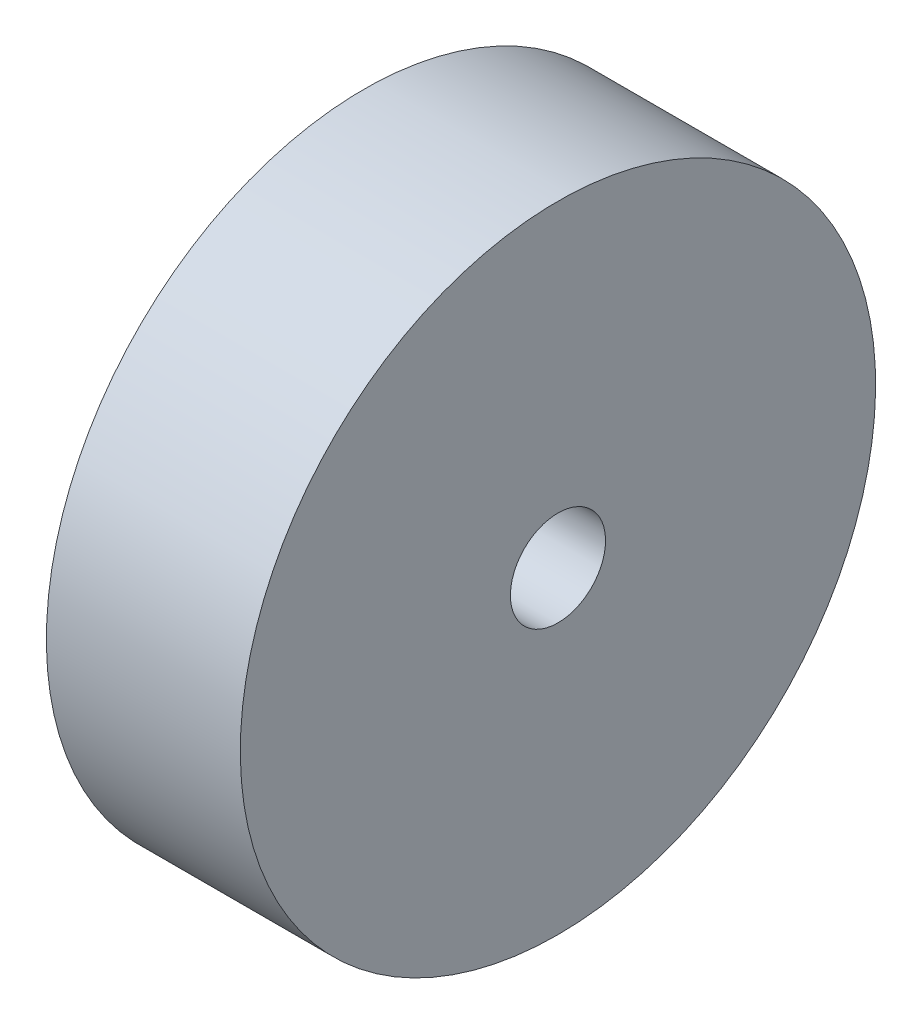
ISO-10303-21;
HEADER;
FILE_DESCRIPTION(('STEP AP214'),'2;1');
FILE_NAME('part.step','',(''),(''),'','','');
FILE_SCHEMA(('AUTOMOTIVE_DESIGN { 1 0 10303 214 1 1 1 1 }'));
ENDSEC;
DATA;
#1=APPLICATION_CONTEXT('core data for automotive mechanical design processes');
#2=APPLICATION_PROTOCOL_DEFINITION('international standard','automotive_design',2000,#1);
#3=PRODUCT_CONTEXT('',#1,'mechanical');
#4=PRODUCT('Part','Part','',(#3));
#5=PRODUCT_RELATED_PRODUCT_CATEGORY('part','',(#4));
#6=PRODUCT_DEFINITION_FORMATION('','',#4);
#7=PRODUCT_DEFINITION_CONTEXT('part definition',#1,'design');
#8=PRODUCT_DEFINITION('design','',#6,#7);
#9=PRODUCT_DEFINITION_SHAPE('','',#8);
#10=(LENGTH_UNIT() NAMED_UNIT(*) SI_UNIT(.MILLI.,.METRE.));
#11=(NAMED_UNIT(*) PLANE_ANGLE_UNIT() SI_UNIT($,.RADIAN.));
#12=(NAMED_UNIT(*) SI_UNIT($,.STERADIAN.) SOLID_ANGLE_UNIT());
#13=UNCERTAINTY_MEASURE_WITH_UNIT(LENGTH_MEASURE(1.E-05),#10,'distance_accuracy_value','');
#14=(GEOMETRIC_REPRESENTATION_CONTEXT(3) GLOBAL_UNCERTAINTY_ASSIGNED_CONTEXT((#13)) GLOBAL_UNIT_ASSIGNED_CONTEXT((#10,
#11,#12)) REPRESENTATION_CONTEXT('',''));
#15=CARTESIAN_POINT('',(0.,0.,0.));
#16=DIRECTION('',(0.,0.,1.));
#17=DIRECTION('',(1.,0.,0.));
#18=AXIS2_PLACEMENT_3D('',#15,#16,#17);
#19=CARTESIAN_POINT('',(-78.8778535634837,0.,0.));
#20=DIRECTION('',(-1.,0.,0.));
#21=DIRECTION('',(0.,-1.,0.));
#22=AXIS2_PLACEMENT_3D('',#19,#20,#21);
#23=CYLINDRICAL_SURFACE('',#22,6.5);
#24=CARTESIAN_POINT('',(13.25,0.,0.));
#25=DIRECTION('',(-1.,0.,0.));
#26=DIRECTION('',(0.,-1.,0.));
#27=AXIS2_PLACEMENT_3D('',#24,#25,#26);
#28=CIRCLE('',#27,6.49999999999999);
#29=CARTESIAN_POINT('',(13.25,-6.49999999999999,0.));
#30=VERTEX_POINT('',#29);
#31=EDGE_CURVE('E44',#30,#30,#28,.T.);
#32=ORIENTED_EDGE('',*,*,#31,.F.);
#33=EDGE_LOOP('',(#32));
#34=FACE_BOUND('',#33,.T.);
#35=CARTESIAN_POINT('',(-13.25,0.,0.));
#36=DIRECTION('',(-1.,0.,0.));
#37=DIRECTION('',(0.,-1.,0.));
#38=AXIS2_PLACEMENT_3D('',#35,#36,#37);
#39=CIRCLE('',#38,6.5);
#40=CARTESIAN_POINT('',(-13.25,-6.50000000000001,0.));
#41=VERTEX_POINT('',#40);
#42=EDGE_CURVE('E10',#41,#41,#39,.T.);
#43=ORIENTED_EDGE('',*,*,#42,.T.);
#44=EDGE_LOOP('',(#43));
#45=FACE_BOUND('',#44,.T.);
#46=ADVANCED_FACE('F30',(#34,#45),#23,.F.);
#47=CARTESIAN_POINT('',(-13.25,6.5,0.));
#48=DIRECTION('',(1.,0.,0.));
#49=DIRECTION('',(0.,1.,0.));
#50=AXIS2_PLACEMENT_3D('',#47,#48,#49);
#51=PLANE('',#50);
#52=ORIENTED_EDGE('',*,*,#42,.F.);
#53=EDGE_LOOP('',(#52));
#54=FACE_BOUND('',#53,.T.);
#55=CARTESIAN_POINT('',(-13.25,0.,0.));
#56=DIRECTION('',(-1.,0.,0.));
#57=DIRECTION('',(0.,-1.,0.));
#58=AXIS2_PLACEMENT_3D('',#55,#56,#57);
#59=CIRCLE('',#58,43.4);
#60=CARTESIAN_POINT('',(-13.25,-43.4,0.));
#61=VERTEX_POINT('',#60);
#62=EDGE_CURVE('E36',#61,#61,#59,.T.);
#63=ORIENTED_EDGE('',*,*,#62,.T.);
#64=EDGE_LOOP('',(#63));
#65=FACE_BOUND('',#64,.T.);
#66=ADVANCED_FACE('F53',(#54,#65),#51,.F.);
#67=CARTESIAN_POINT('',(-78.8778535634837,0.,0.));
#68=DIRECTION('',(-1.,0.,0.));
#69=DIRECTION('',(0.,-1.,0.));
#70=AXIS2_PLACEMENT_3D('',#67,#68,#69);
#71=CYLINDRICAL_SURFACE('',#70,43.4);
#72=ORIENTED_EDGE('',*,*,#62,.F.);
#73=EDGE_LOOP('',(#72));
#74=FACE_BOUND('',#73,.T.);
#75=CARTESIAN_POINT('',(13.25,0.,0.));
#76=DIRECTION('',(-1.,0.,0.));
#77=DIRECTION('',(0.,-1.,0.));
#78=AXIS2_PLACEMENT_3D('',#75,#76,#77);
#79=CIRCLE('',#78,43.4);
#80=CARTESIAN_POINT('',(13.25,-43.4,0.));
#81=VERTEX_POINT('',#80);
#82=EDGE_CURVE('E40',#81,#81,#79,.T.);
#83=ORIENTED_EDGE('',*,*,#82,.T.);
#84=EDGE_LOOP('',(#83));
#85=FACE_BOUND('',#84,.T.);
#86=ADVANCED_FACE('F57',(#74,#85),#71,.T.);
#87=CARTESIAN_POINT('',(13.25,43.4,0.));
#88=DIRECTION('',(-1.,0.,0.));
#89=DIRECTION('',(0.,-1.,0.));
#90=AXIS2_PLACEMENT_3D('',#87,#88,#89);
#91=PLANE('',#90);
#92=ORIENTED_EDGE('',*,*,#82,.F.);
#93=EDGE_LOOP('',(#92));
#94=FACE_BOUND('',#93,.T.);
#95=ORIENTED_EDGE('',*,*,#31,.T.);
#96=EDGE_LOOP('',(#95));
#97=FACE_BOUND('',#96,.T.);
#98=ADVANCED_FACE('F50',(#94,#97),#91,.F.);
#99=CLOSED_SHELL('',(#46,#66,#86,#98));
#100=MANIFOLD_SOLID_BREP('B2',#99);
#101=ADVANCED_BREP_SHAPE_REPRESENTATION('',(#18,#100),#14);
#102=SHAPE_DEFINITION_REPRESENTATION(#9,#101);
ENDSEC;
END-ISO-10303-21;
